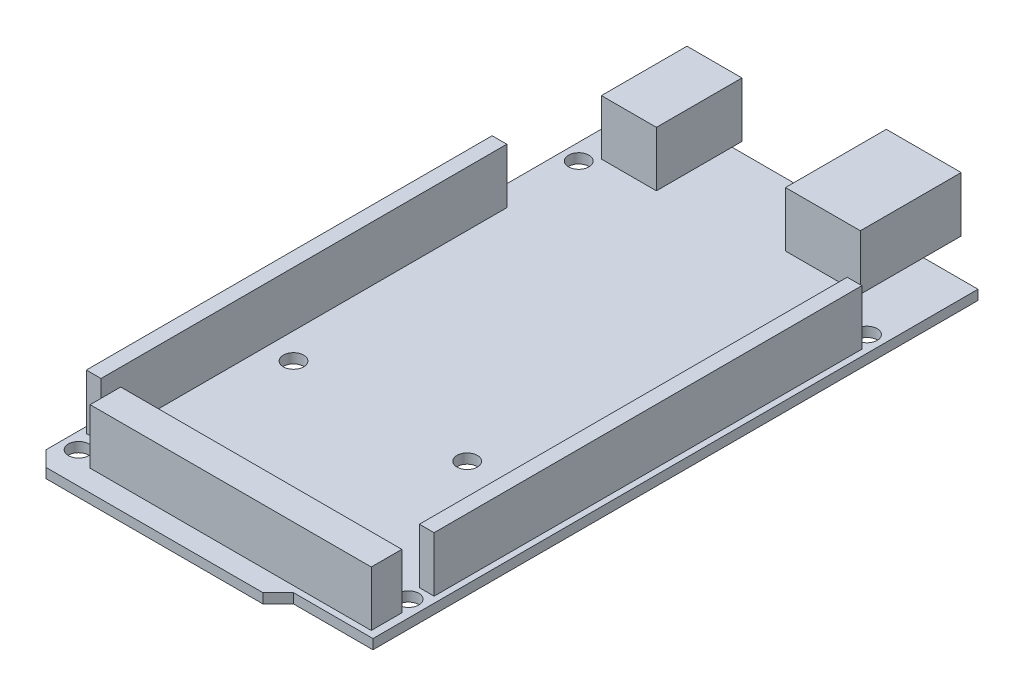
ISO-10303-21;
HEADER;
FILE_DESCRIPTION(('STEP AP214'),'2;1');
FILE_NAME('part.step','',(''),(''),'','','');
FILE_SCHEMA(('AUTOMOTIVE_DESIGN { 1 0 10303 214 1 1 1 1 }'));
ENDSEC;
DATA;
#1=APPLICATION_CONTEXT('core data for automotive mechanical design processes');
#2=APPLICATION_PROTOCOL_DEFINITION('international standard','automotive_design',2000,#1);
#3=PRODUCT_CONTEXT('',#1,'mechanical');
#4=PRODUCT('Part','Part','',(#3));
#5=PRODUCT_RELATED_PRODUCT_CATEGORY('part','',(#4));
#6=PRODUCT_DEFINITION_FORMATION('','',#4);
#7=PRODUCT_DEFINITION_CONTEXT('part definition',#1,'design');
#8=PRODUCT_DEFINITION('design','',#6,#7);
#9=PRODUCT_DEFINITION_SHAPE('','',#8);
#10=(LENGTH_UNIT() NAMED_UNIT(*) SI_UNIT(.MILLI.,.METRE.));
#11=(NAMED_UNIT(*) PLANE_ANGLE_UNIT() SI_UNIT($,.RADIAN.));
#12=(NAMED_UNIT(*) SI_UNIT($,.STERADIAN.) SOLID_ANGLE_UNIT());
#13=UNCERTAINTY_MEASURE_WITH_UNIT(LENGTH_MEASURE(1.E-05),#10,'distance_accuracy_value','');
#14=(GEOMETRIC_REPRESENTATION_CONTEXT(3) GLOBAL_UNCERTAINTY_ASSIGNED_CONTEXT((#13)) GLOBAL_UNIT_ASSIGNED_CONTEXT((#10,
#11,#12)) REPRESENTATION_CONTEXT('',''));
#15=CARTESIAN_POINT('',(0.,0.,0.));
#16=DIRECTION('',(0.,0.,1.));
#17=DIRECTION('',(1.,0.,0.));
#18=AXIS2_PLACEMENT_3D('',#15,#16,#17);
#19=CARTESIAN_POINT('',(0.,1.6,0.));
#20=DIRECTION('',(0.,1.,0.));
#21=DIRECTION('',(0.,0.,1.));
#22=AXIS2_PLACEMENT_3D('',#19,#20,#21);
#23=PLANE('',#22);
#24=CARTESIAN_POINT('',(50.833333333334,1.6,-8.5));
#25=DIRECTION('',(0.,1.,0.));
#26=DIRECTION('',(0.,0.,1.));
#27=AXIS2_PLACEMENT_3D('',#24,#25,#26);
#28=CIRCLE('',#27,1.66666666666666);
#29=CARTESIAN_POINT('',(50.833333333334,1.6,-6.83333333333334));
#30=VERTEX_POINT('',#29);
#31=EDGE_CURVE('E374',#30,#30,#28,.T.);
#32=ORIENTED_EDGE('',*,*,#31,.F.);
#33=EDGE_LOOP('',(#32));
#34=FACE_BOUND('',#33,.T.);
#35=CARTESIAN_POINT('',(2.66666666666667,1.6,-2.66666666666667));
#36=DIRECTION('',(0.,1.,0.));
#37=DIRECTION('',(0.,0.,1.));
#38=AXIS2_PLACEMENT_3D('',#35,#36,#37);
#39=CIRCLE('',#38,1.66666666666667);
#40=CARTESIAN_POINT('',(2.66666666666667,1.6,-1.));
#41=VERTEX_POINT('',#40);
#42=EDGE_CURVE('E377',#41,#41,#39,.T.);
#43=ORIENTED_EDGE('',*,*,#42,.F.);
#44=EDGE_LOOP('',(#43));
#45=FACE_BOUND('',#44,.T.);
#46=CARTESIAN_POINT('',(36.0833333333333,1.6,-32.8333333333333));
#47=DIRECTION('',(0.,1.,0.));
#48=DIRECTION('',(0.,0.,1.));
#49=AXIS2_PLACEMENT_3D('',#46,#47,#48);
#50=CIRCLE('',#49,1.66666666666666);
#51=CARTESIAN_POINT('',(36.0833333333333,1.6,-31.1666666666667));
#52=VERTEX_POINT('',#51);
#53=EDGE_CURVE('E381',#52,#52,#50,.T.);
#54=ORIENTED_EDGE('',*,*,#53,.F.);
#55=EDGE_LOOP('',(#54));
#56=FACE_BOUND('',#55,.T.);
#57=CARTESIAN_POINT('',(7.66666666666667,1.6,-32.8333333333333));
#58=DIRECTION('',(0.,1.,0.));
#59=DIRECTION('',(0.,0.,1.));
#60=AXIS2_PLACEMENT_3D('',#57,#58,#59);
#61=CIRCLE('',#60,1.66666666666667);
#62=CARTESIAN_POINT('',(7.66666666666667,1.6,-31.1666666666667));
#63=VERTEX_POINT('',#62);
#64=EDGE_CURVE('E384',#63,#63,#61,.T.);
#65=ORIENTED_EDGE('',*,*,#64,.F.);
#66=EDGE_LOOP('',(#65));
#67=FACE_BOUND('',#66,.T.);
#68=CARTESIAN_POINT('',(50.8333333333333,1.6,-83.5));
#69=DIRECTION('',(0.,1.,0.));
#70=DIRECTION('',(0.,0.,1.));
#71=AXIS2_PLACEMENT_3D('',#68,#69,#70);
#72=CIRCLE('',#71,1.66666666666667);
#73=CARTESIAN_POINT('',(50.8333333333333,1.6,-81.8333333333333));
#74=VERTEX_POINT('',#73);
#75=EDGE_CURVE('E387',#74,#74,#72,.T.);
#76=ORIENTED_EDGE('',*,*,#75,.F.);
#77=EDGE_LOOP('',(#76));
#78=FACE_BOUND('',#77,.T.);
#79=CARTESIAN_POINT('',(2.66666666666667,1.6,-84.5));
#80=DIRECTION('',(0.,1.,0.));
#81=DIRECTION('',(0.,0.,1.));
#82=AXIS2_PLACEMENT_3D('',#79,#80,#81);
#83=CIRCLE('',#82,1.66666666666667);
#84=CARTESIAN_POINT('',(2.66666666666667,1.6,-82.8333333333333));
#85=VERTEX_POINT('',#84);
#86=EDGE_CURVE('E390',#85,#85,#83,.T.);
#87=ORIENTED_EDGE('',*,*,#86,.F.);
#88=EDGE_LOOP('',(#87));
#89=FACE_BOUND('',#88,.T.);
#90=DIRECTION('',(1.,0.,0.));
#91=VECTOR('',#90,1.);
#92=CARTESIAN_POINT('',(6.22,1.6,-1.));
#93=LINE('',#92,#91);
#94=CARTESIAN_POINT('',(6.22,1.6,-1.));
#95=VERTEX_POINT('',#94);
#96=CARTESIAN_POINT('',(52.22,1.6,-1.));
#97=VERTEX_POINT('',#96);
#98=EDGE_CURVE('E358',#95,#97,#93,.T.);
#99=ORIENTED_EDGE('',*,*,#98,.F.);
#100=DIRECTION('',(0.,0.,1.));
#101=VECTOR('',#100,1.);
#102=CARTESIAN_POINT('',(6.22,1.6,-1.));
#103=LINE('',#102,#101);
#104=CARTESIAN_POINT('',(6.22,1.6,-6.));
#105=VERTEX_POINT('',#104);
#106=EDGE_CURVE('E344',#105,#95,#103,.T.);
#107=ORIENTED_EDGE('',*,*,#106,.F.);
#108=DIRECTION('',(-1.,0.,0.));
#109=VECTOR('',#108,1.);
#110=CARTESIAN_POINT('',(6.22,1.6,-6.));
#111=LINE('',#110,#109);
#112=CARTESIAN_POINT('',(52.22,1.6,-6.));
#113=VERTEX_POINT('',#112);
#114=EDGE_CURVE('E349',#113,#105,#111,.T.);
#115=ORIENTED_EDGE('',*,*,#114,.F.);
#116=DIRECTION('',(0.,0.,-1.));
#117=VECTOR('',#116,1.);
#118=CARTESIAN_POINT('',(52.22,1.6,-1.));
#119=LINE('',#118,#117);
#120=EDGE_CURVE('E360',#97,#113,#119,.T.);
#121=ORIENTED_EDGE('',*,*,#120,.F.);
#122=EDGE_LOOP('',(#99,#107,#115,#121));
#123=FACE_BOUND('',#122,.T.);
#124=DIRECTION('',(1.,0.,0.));
#125=VECTOR('',#124,1.);
#126=CARTESIAN_POINT('',(1.,1.6,-5.60000000000001));
#127=LINE('',#126,#125);
#128=CARTESIAN_POINT('',(1.,1.6,-5.60000000000001));
#129=VERTEX_POINT('',#128);
#130=CARTESIAN_POINT('',(3.4,1.6,-5.60000000000001));
#131=VERTEX_POINT('',#130);
#132=EDGE_CURVE('E329',#129,#131,#127,.T.);
#133=ORIENTED_EDGE('',*,*,#132,.F.);
#134=DIRECTION('',(0.,0.,1.));
#135=VECTOR('',#134,1.);
#136=CARTESIAN_POINT('',(1.,1.6,-5.60000000000001));
#137=LINE('',#136,#135);
#138=CARTESIAN_POINT('',(1.,1.6,-72.));
#139=VERTEX_POINT('',#138);
#140=EDGE_CURVE('E315',#139,#129,#137,.T.);
#141=ORIENTED_EDGE('',*,*,#140,.F.);
#142=DIRECTION('',(-1.,0.,0.));
#143=VECTOR('',#142,1.);
#144=CARTESIAN_POINT('',(1.,1.6,-72.));
#145=LINE('',#144,#143);
#146=CARTESIAN_POINT('',(3.39999999999998,1.6,-72.));
#147=VERTEX_POINT('',#146);
#148=EDGE_CURVE('E320',#147,#139,#145,.T.);
#149=ORIENTED_EDGE('',*,*,#148,.F.);
#150=DIRECTION('',(0.,0.,-1.));
#151=VECTOR('',#150,1.);
#152=CARTESIAN_POINT('',(3.4,1.6,-5.60000000000001));
#153=LINE('',#152,#151);
#154=EDGE_CURVE('E331',#131,#147,#153,.T.);
#155=ORIENTED_EDGE('',*,*,#154,.F.);
#156=EDGE_LOOP('',(#133,#141,#149,#155));
#157=FACE_BOUND('',#156,.T.);
#158=DIRECTION('',(1.,0.,0.));
#159=VECTOR('',#158,1.);
#160=CARTESIAN_POINT('',(50.1,1.6,-11.));
#161=LINE('',#160,#159);
#162=CARTESIAN_POINT('',(50.1,1.6,-11.));
#163=VERTEX_POINT('',#162);
#164=CARTESIAN_POINT('',(52.5,1.6,-11.));
#165=VERTEX_POINT('',#164);
#166=EDGE_CURVE('E300',#163,#165,#161,.T.);
#167=ORIENTED_EDGE('',*,*,#166,.F.);
#168=DIRECTION('',(0.,0.,1.));
#169=VECTOR('',#168,1.);
#170=CARTESIAN_POINT('',(50.1,1.6,-11.));
#171=LINE('',#170,#169);
#172=CARTESIAN_POINT('',(50.1,1.6,-81.));
#173=VERTEX_POINT('',#172);
#174=EDGE_CURVE('E286',#173,#163,#171,.T.);
#175=ORIENTED_EDGE('',*,*,#174,.F.);
#176=DIRECTION('',(-1.,0.,0.));
#177=VECTOR('',#176,1.);
#178=CARTESIAN_POINT('',(50.1,1.6,-81.));
#179=LINE('',#178,#177);
#180=CARTESIAN_POINT('',(52.5,1.6,-81.));
#181=VERTEX_POINT('',#180);
#182=EDGE_CURVE('E291',#181,#173,#179,.T.);
#183=ORIENTED_EDGE('',*,*,#182,.F.);
#184=DIRECTION('',(0.,0.,-1.));
#185=VECTOR('',#184,1.);
#186=CARTESIAN_POINT('',(52.5,1.6,-11.));
#187=LINE('',#186,#185);
#188=EDGE_CURVE('E302',#165,#181,#187,.T.);
#189=ORIENTED_EDGE('',*,*,#188,.F.);
#190=EDGE_LOOP('',(#167,#175,#183,#189));
#191=FACE_BOUND('',#190,.T.);
#192=DIRECTION('',(1.,0.,0.));
#193=VECTOR('',#192,1.);
#194=CARTESIAN_POINT('',(32.34,1.6,-88.66));
#195=LINE('',#194,#193);
#196=CARTESIAN_POINT('',(32.34,1.6,-88.66));
#197=VERTEX_POINT('',#196);
#198=CARTESIAN_POINT('',(44.59,1.6,-88.66));
#199=VERTEX_POINT('',#198);
#200=EDGE_CURVE('E512',#197,#199,#195,.T.);
#201=ORIENTED_EDGE('',*,*,#200,.F.);
#202=DIRECTION('',(0.,0.,1.));
#203=VECTOR('',#202,1.);
#204=CARTESIAN_POINT('',(32.34,1.6,-88.66));
#205=LINE('',#204,#203);
#206=CARTESIAN_POINT('',(32.34,1.6,-99.));
#207=VERTEX_POINT('',#206);
#208=EDGE_CURVE('E250',#207,#197,#205,.T.);
#209=ORIENTED_EDGE('',*,*,#208,.F.);
#210=DIRECTION('',(1.,0.,0.));
#211=VECTOR('',#210,1.);
#212=CARTESIAN_POINT('',(0.,1.6,-99.));
#213=LINE('',#212,#211);
#214=CARTESIAN_POINT('',(13.25,1.6,-99.));
#215=VERTEX_POINT('',#214);
#216=EDGE_CURVE('E503',#215,#207,#213,.T.);
#217=ORIENTED_EDGE('',*,*,#216,.F.);
#218=DIRECTION('',(0.,0.,-1.));
#219=VECTOR('',#218,1.);
#220=CARTESIAN_POINT('',(13.25,1.6,-86.63));
#221=LINE('',#220,#219);
#222=CARTESIAN_POINT('',(13.25,1.6,-86.63));
#223=VERTEX_POINT('',#222);
#224=EDGE_CURVE('E56',#223,#215,#221,.T.);
#225=ORIENTED_EDGE('',*,*,#224,.F.);
#226=DIRECTION('',(1.,0.,0.));
#227=VECTOR('',#226,1.);
#228=CARTESIAN_POINT('',(4.25,1.6,-86.63));
#229=LINE('',#228,#227);
#230=CARTESIAN_POINT('',(4.25,1.6,-86.63));
#231=VERTEX_POINT('',#230);
#232=EDGE_CURVE('E271',#231,#223,#229,.T.);
#233=ORIENTED_EDGE('',*,*,#232,.F.);
#234=DIRECTION('',(0.,0.,1.));
#235=VECTOR('',#234,1.);
#236=CARTESIAN_POINT('',(4.25,1.6,-86.63));
#237=LINE('',#236,#235);
#238=CARTESIAN_POINT('',(4.25,1.6,-99.));
#239=VERTEX_POINT('',#238);
#240=EDGE_CURVE('E251',#239,#231,#237,.T.);
#241=ORIENTED_EDGE('',*,*,#240,.F.);
#242=CARTESIAN_POINT('',(0.,1.6,-99.));
#243=VERTEX_POINT('',#242);
#244=EDGE_CURVE('E400',#243,#239,#213,.T.);
#245=ORIENTED_EDGE('',*,*,#244,.F.);
#246=DIRECTION('',(0.,0.,-1.));
#247=VECTOR('',#246,1.);
#248=CARTESIAN_POINT('',(0.,1.6,0.));
#249=LINE('',#248,#247);
#250=CARTESIAN_POINT('',(0.,1.6,0.));
#251=VERTEX_POINT('',#250);
#252=EDGE_CURVE('E403',#251,#243,#249,.T.);
#253=ORIENTED_EDGE('',*,*,#252,.F.);
#254=DIRECTION('',(-0.707106781186551,0.,-0.707106781186544));
#255=VECTOR('',#254,1.);
#256=CARTESIAN_POINT('',(0.,1.6,0.));
#257=LINE('',#256,#255);
#258=CARTESIAN_POINT('',(2.50000000000003,1.6,2.5));
#259=VERTEX_POINT('',#258);
#260=EDGE_CURVE('E407',#259,#251,#257,.T.);
#261=ORIENTED_EDGE('',*,*,#260,.F.);
#262=DIRECTION('',(1.,0.,0.));
#263=VECTOR('',#262,1.);
#264=CARTESIAN_POINT('',(0.,1.6,2.5));
#265=LINE('',#264,#263);
#266=CARTESIAN_POINT('',(38.,1.6,2.5));
#267=VERTEX_POINT('',#266);
#268=EDGE_CURVE('E410',#259,#267,#265,.T.);
#269=ORIENTED_EDGE('',*,*,#268,.T.);
#270=DIRECTION('',(0.707106781186547,0.,-0.707106781186549));
#271=VECTOR('',#270,1.);
#272=CARTESIAN_POINT('',(20.2500000000001,1.6,20.25));
#273=LINE('',#272,#271);
#274=CARTESIAN_POINT('',(40.5,1.6,0.));
#275=VERTEX_POINT('',#274);
#276=EDGE_CURVE('E412',#267,#275,#273,.T.);
#277=ORIENTED_EDGE('',*,*,#276,.T.);
#278=DIRECTION('',(1.,0.,0.));
#279=VECTOR('',#278,1.);
#280=CARTESIAN_POINT('',(0.,1.6,0.));
#281=LINE('',#280,#279);
#282=CARTESIAN_POINT('',(53.5,1.6,0.));
#283=VERTEX_POINT('',#282);
#284=EDGE_CURVE('E393',#275,#283,#281,.T.);
#285=ORIENTED_EDGE('',*,*,#284,.T.);
#286=DIRECTION('',(0.,0.,-1.));
#287=VECTOR('',#286,1.);
#288=CARTESIAN_POINT('',(53.5,1.6,0.));
#289=LINE('',#288,#287);
#290=CARTESIAN_POINT('',(53.5,1.6,-99.));
#291=VERTEX_POINT('',#290);
#292=EDGE_CURVE('E396',#283,#291,#289,.T.);
#293=ORIENTED_EDGE('',*,*,#292,.T.);
#294=CARTESIAN_POINT('',(44.59,1.6,-99.));
#295=VERTEX_POINT('',#294);
#296=EDGE_CURVE('E399',#295,#291,#213,.T.);
#297=ORIENTED_EDGE('',*,*,#296,.F.);
#298=DIRECTION('',(0.,0.,-1.));
#299=VECTOR('',#298,1.);
#300=CARTESIAN_POINT('',(44.59,1.6,-88.66));
#301=LINE('',#300,#299);
#302=EDGE_CURVE('E48',#199,#295,#301,.T.);
#303=ORIENTED_EDGE('',*,*,#302,.F.);
#304=EDGE_LOOP('',(#201,#209,#217,#225,#233,#241,#245,#253,#261,#269,#277,#285,#293,#297,#303));
#305=FACE_BOUND('',#304,.T.);
#306=ADVANCED_FACE('F33',(#34,#45,#56,#67,#78,#89,#123,#157,#191,#305),#23,.T.);
#307=CARTESIAN_POINT('',(0.,1.6,0.));
#308=DIRECTION('',(0.,0.,-1.));
#309=DIRECTION('',(-1.,0.,0.));
#310=AXIS2_PLACEMENT_3D('',#307,#308,#309);
#311=PLANE('',#310);
#312=DIRECTION('',(1.,0.,0.));
#313=VECTOR('',#312,1.);
#314=CARTESIAN_POINT('',(0.,0.,0.));
#315=LINE('',#314,#313);
#316=CARTESIAN_POINT('',(40.5,0.,0.));
#317=VERTEX_POINT('',#316);
#318=CARTESIAN_POINT('',(53.5,0.,0.));
#319=VERTEX_POINT('',#318);
#320=EDGE_CURVE('E432',#317,#319,#315,.T.);
#321=ORIENTED_EDGE('',*,*,#320,.T.);
#322=DIRECTION('',(0.,-1.,0.));
#323=VECTOR('',#322,1.);
#324=CARTESIAN_POINT('',(53.5,1.6,0.));
#325=LINE('',#324,#323);
#326=EDGE_CURVE('E11',#283,#319,#325,.T.);
#327=ORIENTED_EDGE('',*,*,#326,.F.);
#328=ORIENTED_EDGE('',*,*,#284,.F.);
#329=DIRECTION('',(0.,-1.,0.));
#330=VECTOR('',#329,1.);
#331=CARTESIAN_POINT('',(40.5,1.6,0.));
#332=LINE('',#331,#330);
#333=EDGE_CURVE('E414',#275,#317,#332,.T.);
#334=ORIENTED_EDGE('',*,*,#333,.T.);
#335=EDGE_LOOP('',(#321,#327,#328,#334));
#336=FACE_BOUND('',#335,.T.);
#337=ADVANCED_FACE('F529',(#336),#311,.F.);
#338=CARTESIAN_POINT('',(53.5,1.6,0.));
#339=DIRECTION('',(-1.,0.,0.));
#340=DIRECTION('',(0.,0.,1.));
#341=AXIS2_PLACEMENT_3D('',#338,#339,#340);
#342=PLANE('',#341);
#343=DIRECTION('',(0.,0.,-1.));
#344=VECTOR('',#343,1.);
#345=CARTESIAN_POINT('',(53.5,0.,0.));
#346=LINE('',#345,#344);
#347=CARTESIAN_POINT('',(53.5,0.,-99.));
#348=VERTEX_POINT('',#347);
#349=EDGE_CURVE('E435',#319,#348,#346,.T.);
#350=ORIENTED_EDGE('',*,*,#349,.T.);
#351=DIRECTION('',(0.,-1.,0.));
#352=VECTOR('',#351,1.);
#353=CARTESIAN_POINT('',(53.5,1.6,-99.));
#354=LINE('',#353,#352);
#355=EDGE_CURVE('E41',#291,#348,#354,.T.);
#356=ORIENTED_EDGE('',*,*,#355,.F.);
#357=ORIENTED_EDGE('',*,*,#292,.F.);
#358=ORIENTED_EDGE('',*,*,#326,.T.);
#359=EDGE_LOOP('',(#350,#356,#357,#358));
#360=FACE_BOUND('',#359,.T.);
#361=ADVANCED_FACE('F467',(#360),#342,.F.);
#362=CARTESIAN_POINT('',(0.,1.6,-99.));
#363=DIRECTION('',(0.,0.,-1.));
#364=DIRECTION('',(-1.,0.,0.));
#365=AXIS2_PLACEMENT_3D('',#362,#363,#364);
#366=PLANE('',#365);
#367=DIRECTION('',(1.,0.,0.));
#368=VECTOR('',#367,1.);
#369=CARTESIAN_POINT('',(0.,0.,-99.));
#370=LINE('',#369,#368);
#371=CARTESIAN_POINT('',(0.,0.,-99.));
#372=VERTEX_POINT('',#371);
#373=EDGE_CURVE('E438',#372,#348,#370,.T.);
#374=ORIENTED_EDGE('',*,*,#373,.F.);
#375=DIRECTION('',(0.,-1.,0.));
#376=VECTOR('',#375,1.);
#377=CARTESIAN_POINT('',(0.,1.6,-99.));
#378=LINE('',#377,#376);
#379=EDGE_CURVE('E459',#243,#372,#378,.T.);
#380=ORIENTED_EDGE('',*,*,#379,.F.);
#381=ORIENTED_EDGE('',*,*,#244,.T.);
#382=EDGE_CURVE('E404',#239,#215,#213,.T.);
#383=ORIENTED_EDGE('',*,*,#382,.T.);
#384=ORIENTED_EDGE('',*,*,#216,.T.);
#385=EDGE_CURVE('E504',#207,#295,#213,.T.);
#386=ORIENTED_EDGE('',*,*,#385,.T.);
#387=ORIENTED_EDGE('',*,*,#296,.T.);
#388=ORIENTED_EDGE('',*,*,#355,.T.);
#389=EDGE_LOOP('',(#374,#380,#381,#383,#384,#386,#387,#388));
#390=FACE_BOUND('',#389,.T.);
#391=ADVANCED_FACE('F463',(#390),#366,.T.);
#392=CARTESIAN_POINT('',(0.,1.6,0.));
#393=DIRECTION('',(-1.,0.,0.));
#394=DIRECTION('',(0.,0.,1.));
#395=AXIS2_PLACEMENT_3D('',#392,#393,#394);
#396=PLANE('',#395);
#397=DIRECTION('',(0.,0.,-1.));
#398=VECTOR('',#397,1.);
#399=CARTESIAN_POINT('',(0.,0.,0.));
#400=LINE('',#399,#398);
#401=CARTESIAN_POINT('',(0.,0.,0.));
#402=VERTEX_POINT('',#401);
#403=EDGE_CURVE('E441',#402,#372,#400,.T.);
#404=ORIENTED_EDGE('',*,*,#403,.F.);
#405=DIRECTION('',(0.,-1.,0.));
#406=VECTOR('',#405,1.);
#407=CARTESIAN_POINT('',(0.,1.6,0.));
#408=LINE('',#407,#406);
#409=EDGE_CURVE('E457',#251,#402,#408,.T.);
#410=ORIENTED_EDGE('',*,*,#409,.F.);
#411=ORIENTED_EDGE('',*,*,#252,.T.);
#412=ORIENTED_EDGE('',*,*,#379,.T.);
#413=EDGE_LOOP('',(#404,#410,#411,#412));
#414=FACE_BOUND('',#413,.T.);
#415=ADVANCED_FACE('F476',(#414),#396,.T.);
#416=CARTESIAN_POINT('',(0.,1.6,0.));
#417=DIRECTION('',(-0.707106781186544,0.,0.707106781186551));
#418=DIRECTION('',(0.707106781186551,0.,0.707106781186544));
#419=AXIS2_PLACEMENT_3D('',#416,#417,#418);
#420=PLANE('',#419);
#421=DIRECTION('',(-0.707106781186551,0.,-0.707106781186544));
#422=VECTOR('',#421,1.);
#423=CARTESIAN_POINT('',(0.,0.,0.));
#424=LINE('',#423,#422);
#425=CARTESIAN_POINT('',(2.50000000000003,0.,2.5));
#426=VERTEX_POINT('',#425);
#427=EDGE_CURVE('E444',#426,#402,#424,.T.);
#428=ORIENTED_EDGE('',*,*,#427,.F.);
#429=DIRECTION('',(0.,-1.,0.));
#430=VECTOR('',#429,1.);
#431=CARTESIAN_POINT('',(2.50000000000003,1.6,2.5));
#432=LINE('',#431,#430);
#433=EDGE_CURVE('E455',#259,#426,#432,.T.);
#434=ORIENTED_EDGE('',*,*,#433,.F.);
#435=ORIENTED_EDGE('',*,*,#260,.T.);
#436=ORIENTED_EDGE('',*,*,#409,.T.);
#437=EDGE_LOOP('',(#428,#434,#435,#436));
#438=FACE_BOUND('',#437,.T.);
#439=ADVANCED_FACE('F538',(#438),#420,.T.);
#440=CARTESIAN_POINT('',(0.,1.6,2.5));
#441=DIRECTION('',(0.,0.,-1.));
#442=DIRECTION('',(-1.,0.,0.));
#443=AXIS2_PLACEMENT_3D('',#440,#441,#442);
#444=PLANE('',#443);
#445=DIRECTION('',(1.,0.,0.));
#446=VECTOR('',#445,1.);
#447=CARTESIAN_POINT('',(0.,0.,2.5));
#448=LINE('',#447,#446);
#449=CARTESIAN_POINT('',(38.,0.,2.5));
#450=VERTEX_POINT('',#449);
#451=EDGE_CURVE('E447',#426,#450,#448,.T.);
#452=ORIENTED_EDGE('',*,*,#451,.T.);
#453=DIRECTION('',(0.,-1.,0.));
#454=VECTOR('',#453,1.);
#455=CARTESIAN_POINT('',(38.,1.6,2.5));
#456=LINE('',#455,#454);
#457=EDGE_CURVE('E452',#267,#450,#456,.T.);
#458=ORIENTED_EDGE('',*,*,#457,.F.);
#459=ORIENTED_EDGE('',*,*,#268,.F.);
#460=ORIENTED_EDGE('',*,*,#433,.T.);
#461=EDGE_LOOP('',(#452,#458,#459,#460));
#462=FACE_BOUND('',#461,.T.);
#463=ADVANCED_FACE('F536',(#462),#444,.F.);
#464=CARTESIAN_POINT('',(2.66666666666667,1.6,-84.5));
#465=DIRECTION('',(0.,-1.,0.));
#466=DIRECTION('',(0.,0.,-1.));
#467=AXIS2_PLACEMENT_3D('',#464,#465,#466);
#468=CYLINDRICAL_SURFACE('',#467,1.66666666666667);
#469=ORIENTED_EDGE('',*,*,#86,.T.);
#470=EDGE_LOOP('',(#469));
#471=FACE_BOUND('',#470,.T.);
#472=CARTESIAN_POINT('',(2.66666666666667,0.,-84.5));
#473=DIRECTION('',(0.,1.,0.));
#474=DIRECTION('',(0.,0.,1.));
#475=AXIS2_PLACEMENT_3D('',#472,#473,#474);
#476=CIRCLE('',#475,1.66666666666667);
#477=CARTESIAN_POINT('',(2.66666666666667,0.,-82.8333333333333));
#478=VERTEX_POINT('',#477);
#479=EDGE_CURVE('E429',#478,#478,#476,.T.);
#480=ORIENTED_EDGE('',*,*,#479,.F.);
#481=EDGE_LOOP('',(#480));
#482=FACE_BOUND('',#481,.T.);
#483=ADVANCED_FACE('F545',(#471,#482),#468,.F.);
#484=CARTESIAN_POINT('',(50.8333333333333,1.6,-83.5));
#485=DIRECTION('',(0.,-1.,0.));
#486=DIRECTION('',(0.,0.,-1.));
#487=AXIS2_PLACEMENT_3D('',#484,#485,#486);
#488=CYLINDRICAL_SURFACE('',#487,1.66666666666667);
#489=ORIENTED_EDGE('',*,*,#75,.T.);
#490=EDGE_LOOP('',(#489));
#491=FACE_BOUND('',#490,.T.);
#492=CARTESIAN_POINT('',(50.8333333333333,0.,-83.5));
#493=DIRECTION('',(0.,1.,0.));
#494=DIRECTION('',(0.,0.,1.));
#495=AXIS2_PLACEMENT_3D('',#492,#493,#494);
#496=CIRCLE('',#495,1.66666666666667);
#497=CARTESIAN_POINT('',(50.8333333333333,0.,-81.8333333333333));
#498=VERTEX_POINT('',#497);
#499=EDGE_CURVE('E426',#498,#498,#496,.T.);
#500=ORIENTED_EDGE('',*,*,#499,.F.);
#501=EDGE_LOOP('',(#500));
#502=FACE_BOUND('',#501,.T.);
#503=ADVANCED_FACE('F591',(#491,#502),#488,.F.);
#504=CARTESIAN_POINT('',(7.66666666666667,1.6,-32.8333333333333));
#505=DIRECTION('',(0.,-1.,0.));
#506=DIRECTION('',(0.,0.,-1.));
#507=AXIS2_PLACEMENT_3D('',#504,#505,#506);
#508=CYLINDRICAL_SURFACE('',#507,1.66666666666667);
#509=ORIENTED_EDGE('',*,*,#64,.T.);
#510=EDGE_LOOP('',(#509));
#511=FACE_BOUND('',#510,.T.);
#512=CARTESIAN_POINT('',(7.66666666666667,0.,-32.8333333333333));
#513=DIRECTION('',(0.,1.,0.));
#514=DIRECTION('',(0.,0.,1.));
#515=AXIS2_PLACEMENT_3D('',#512,#513,#514);
#516=CIRCLE('',#515,1.66666666666667);
#517=CARTESIAN_POINT('',(7.66666666666667,0.,-31.1666666666667));
#518=VERTEX_POINT('',#517);
#519=EDGE_CURVE('E423',#518,#518,#516,.T.);
#520=ORIENTED_EDGE('',*,*,#519,.F.);
#521=EDGE_LOOP('',(#520));
#522=FACE_BOUND('',#521,.T.);
#523=ADVANCED_FACE('F597',(#511,#522),#508,.F.);
#524=CARTESIAN_POINT('',(36.0833333333333,1.6,-32.8333333333333));
#525=DIRECTION('',(0.,-1.,0.));
#526=DIRECTION('',(0.,0.,-1.));
#527=AXIS2_PLACEMENT_3D('',#524,#525,#526);
#528=CYLINDRICAL_SURFACE('',#527,1.66666666666666);
#529=ORIENTED_EDGE('',*,*,#53,.T.);
#530=EDGE_LOOP('',(#529));
#531=FACE_BOUND('',#530,.T.);
#532=CARTESIAN_POINT('',(36.0833333333333,0.,-32.8333333333333));
#533=DIRECTION('',(0.,1.,0.));
#534=DIRECTION('',(0.,0.,1.));
#535=AXIS2_PLACEMENT_3D('',#532,#533,#534);
#536=CIRCLE('',#535,1.66666666666666);
#537=CARTESIAN_POINT('',(36.0833333333333,0.,-31.1666666666667));
#538=VERTEX_POINT('',#537);
#539=EDGE_CURVE('E420',#538,#538,#536,.T.);
#540=ORIENTED_EDGE('',*,*,#539,.F.);
#541=EDGE_LOOP('',(#540));
#542=FACE_BOUND('',#541,.T.);
#543=ADVANCED_FACE('F575',(#531,#542),#528,.F.);
#544=CARTESIAN_POINT('',(2.66666666666667,1.6,-2.66666666666667));
#545=DIRECTION('',(0.,-1.,0.));
#546=DIRECTION('',(0.,0.,-1.));
#547=AXIS2_PLACEMENT_3D('',#544,#545,#546);
#548=CYLINDRICAL_SURFACE('',#547,1.66666666666667);
#549=ORIENTED_EDGE('',*,*,#42,.T.);
#550=EDGE_LOOP('',(#549));
#551=FACE_BOUND('',#550,.T.);
#552=CARTESIAN_POINT('',(2.66666666666667,0.,-2.66666666666667));
#553=DIRECTION('',(0.,1.,0.));
#554=DIRECTION('',(0.,0.,1.));
#555=AXIS2_PLACEMENT_3D('',#552,#553,#554);
#556=CIRCLE('',#555,1.66666666666667);
#557=CARTESIAN_POINT('',(2.66666666666667,0.,-1.));
#558=VERTEX_POINT('',#557);
#559=EDGE_CURVE('E417',#558,#558,#556,.T.);
#560=ORIENTED_EDGE('',*,*,#559,.F.);
#561=EDGE_LOOP('',(#560));
#562=FACE_BOUND('',#561,.T.);
#563=ADVANCED_FACE('F570',(#551,#562),#548,.F.);
#564=CARTESIAN_POINT('',(50.833333333334,1.6,-8.5));
#565=DIRECTION('',(0.,-1.,0.));
#566=DIRECTION('',(0.,0.,-1.));
#567=AXIS2_PLACEMENT_3D('',#564,#565,#566);
#568=CYLINDRICAL_SURFACE('',#567,1.66666666666666);
#569=ORIENTED_EDGE('',*,*,#31,.T.);
#570=EDGE_LOOP('',(#569));
#571=FACE_BOUND('',#570,.T.);
#572=CARTESIAN_POINT('',(50.833333333334,0.,-8.5));
#573=DIRECTION('',(0.,1.,0.));
#574=DIRECTION('',(0.,0.,1.));
#575=AXIS2_PLACEMENT_3D('',#572,#573,#574);
#576=CIRCLE('',#575,1.66666666666666);
#577=CARTESIAN_POINT('',(50.833333333334,0.,-6.83333333333334));
#578=VERTEX_POINT('',#577);
#579=EDGE_CURVE('E373',#578,#578,#576,.T.);
#580=ORIENTED_EDGE('',*,*,#579,.F.);
#581=EDGE_LOOP('',(#580));
#582=FACE_BOUND('',#581,.T.);
#583=ADVANCED_FACE('F35',(#571,#582),#568,.F.);
#584=CARTESIAN_POINT('',(20.2500000000001,1.6,20.25));
#585=DIRECTION('',(-0.707106781186548,0.,-0.707106781186546));
#586=DIRECTION('',(-0.707106781186547,0.,0.707106781186549));
#587=AXIS2_PLACEMENT_3D('',#584,#585,#586);
#588=PLANE('',#587);
#589=DIRECTION('',(0.707106781186547,0.,-0.707106781186549));
#590=VECTOR('',#589,1.);
#591=CARTESIAN_POINT('',(20.2500000000001,0.,20.25));
#592=LINE('',#591,#590);
#593=EDGE_CURVE('E378',#450,#317,#592,.T.);
#594=ORIENTED_EDGE('',*,*,#593,.T.);
#595=ORIENTED_EDGE('',*,*,#333,.F.);
#596=ORIENTED_EDGE('',*,*,#276,.F.);
#597=ORIENTED_EDGE('',*,*,#457,.T.);
#598=EDGE_LOOP('',(#594,#595,#596,#597));
#599=FACE_BOUND('',#598,.T.);
#600=ADVANCED_FACE('F532',(#599),#588,.F.);
#601=CARTESIAN_POINT('',(0.,0.,0.));
#602=DIRECTION('',(0.,1.,0.));
#603=DIRECTION('',(0.,0.,1.));
#604=AXIS2_PLACEMENT_3D('',#601,#602,#603);
#605=PLANE('',#604);
#606=ORIENTED_EDGE('',*,*,#579,.T.);
#607=EDGE_LOOP('',(#606));
#608=FACE_BOUND('',#607,.T.);
#609=ORIENTED_EDGE('',*,*,#559,.T.);
#610=EDGE_LOOP('',(#609));
#611=FACE_BOUND('',#610,.T.);
#612=ORIENTED_EDGE('',*,*,#539,.T.);
#613=EDGE_LOOP('',(#612));
#614=FACE_BOUND('',#613,.T.);
#615=ORIENTED_EDGE('',*,*,#519,.T.);
#616=EDGE_LOOP('',(#615));
#617=FACE_BOUND('',#616,.T.);
#618=ORIENTED_EDGE('',*,*,#499,.T.);
#619=EDGE_LOOP('',(#618));
#620=FACE_BOUND('',#619,.T.);
#621=ORIENTED_EDGE('',*,*,#479,.T.);
#622=EDGE_LOOP('',(#621));
#623=FACE_BOUND('',#622,.T.);
#624=ORIENTED_EDGE('',*,*,#320,.F.);
#625=ORIENTED_EDGE('',*,*,#593,.F.);
#626=ORIENTED_EDGE('',*,*,#451,.F.);
#627=ORIENTED_EDGE('',*,*,#427,.T.);
#628=ORIENTED_EDGE('',*,*,#403,.T.);
#629=ORIENTED_EDGE('',*,*,#373,.T.);
#630=ORIENTED_EDGE('',*,*,#349,.F.);
#631=EDGE_LOOP('',(#624,#625,#626,#627,#628,#629,#630));
#632=FACE_BOUND('',#631,.T.);
#633=ADVANCED_FACE('F471',(#608,#611,#614,#617,#620,#623,#632),#605,.F.);
#634=CARTESIAN_POINT('',(6.22,10.6,-1.));
#635=DIRECTION('',(1.,0.,0.));
#636=DIRECTION('',(0.,0.,-1.));
#637=AXIS2_PLACEMENT_3D('',#634,#635,#636);
#638=PLANE('',#637);
#639=ORIENTED_EDGE('',*,*,#106,.T.);
#640=DIRECTION('',(0.,-1.,0.));
#641=VECTOR('',#640,1.);
#642=CARTESIAN_POINT('',(6.22,10.6,-1.));
#643=LINE('',#642,#641);
#644=CARTESIAN_POINT('',(6.22,10.6,-1.));
#645=VERTEX_POINT('',#644);
#646=EDGE_CURVE('E371',#645,#95,#643,.T.);
#647=ORIENTED_EDGE('',*,*,#646,.F.);
#648=DIRECTION('',(0.,0.,1.));
#649=VECTOR('',#648,1.);
#650=CARTESIAN_POINT('',(6.22,10.6,-1.));
#651=LINE('',#650,#649);
#652=CARTESIAN_POINT('',(6.22,10.6,-6.));
#653=VERTEX_POINT('',#652);
#654=EDGE_CURVE('E345',#653,#645,#651,.T.);
#655=ORIENTED_EDGE('',*,*,#654,.F.);
#656=DIRECTION('',(0.,-1.,0.));
#657=VECTOR('',#656,1.);
#658=CARTESIAN_POINT('',(6.22,10.6,-6.));
#659=LINE('',#658,#657);
#660=EDGE_CURVE('E355',#653,#105,#659,.T.);
#661=ORIENTED_EDGE('',*,*,#660,.T.);
#662=EDGE_LOOP('',(#639,#647,#655,#661));
#663=FACE_BOUND('',#662,.T.);
#664=ADVANCED_FACE('F561',(#663),#638,.F.);
#665=CARTESIAN_POINT('',(6.22,10.6,-1.));
#666=DIRECTION('',(0.,0.,-1.));
#667=DIRECTION('',(-1.,0.,0.));
#668=AXIS2_PLACEMENT_3D('',#665,#666,#667);
#669=PLANE('',#668);
#670=ORIENTED_EDGE('',*,*,#98,.T.);
#671=DIRECTION('',(0.,-1.,0.));
#672=VECTOR('',#671,1.);
#673=CARTESIAN_POINT('',(52.22,10.6,-1.));
#674=LINE('',#673,#672);
#675=CARTESIAN_POINT('',(52.22,10.6,-1.));
#676=VERTEX_POINT('',#675);
#677=EDGE_CURVE('E368',#676,#97,#674,.T.);
#678=ORIENTED_EDGE('',*,*,#677,.F.);
#679=DIRECTION('',(1.,0.,0.));
#680=VECTOR('',#679,1.);
#681=CARTESIAN_POINT('',(6.22,10.6,-1.));
#682=LINE('',#681,#680);
#683=EDGE_CURVE('E348',#645,#676,#682,.T.);
#684=ORIENTED_EDGE('',*,*,#683,.F.);
#685=ORIENTED_EDGE('',*,*,#646,.T.);
#686=EDGE_LOOP('',(#670,#678,#684,#685));
#687=FACE_BOUND('',#686,.T.);
#688=ADVANCED_FACE('F692',(#687),#669,.F.);
#689=CARTESIAN_POINT('',(52.22,10.6,-1.));
#690=DIRECTION('',(-1.,0.,0.));
#691=DIRECTION('',(0.,0.,1.));
#692=AXIS2_PLACEMENT_3D('',#689,#690,#691);
#693=PLANE('',#692);
#694=ORIENTED_EDGE('',*,*,#120,.T.);
#695=DIRECTION('',(0.,-1.,0.));
#696=VECTOR('',#695,1.);
#697=CARTESIAN_POINT('',(52.22,10.6,-6.));
#698=LINE('',#697,#696);
#699=CARTESIAN_POINT('',(52.22,10.6,-6.));
#700=VERTEX_POINT('',#699);
#701=EDGE_CURVE('E366',#700,#113,#698,.T.);
#702=ORIENTED_EDGE('',*,*,#701,.F.);
#703=DIRECTION('',(0.,0.,-1.));
#704=VECTOR('',#703,1.);
#705=CARTESIAN_POINT('',(52.22,10.6,-1.));
#706=LINE('',#705,#704);
#707=EDGE_CURVE('E351',#676,#700,#706,.T.);
#708=ORIENTED_EDGE('',*,*,#707,.F.);
#709=ORIENTED_EDGE('',*,*,#677,.T.);
#710=EDGE_LOOP('',(#694,#702,#708,#709));
#711=FACE_BOUND('',#710,.T.);
#712=ADVANCED_FACE('F689',(#711),#693,.F.);
#713=CARTESIAN_POINT('',(6.22,10.6,-6.));
#714=DIRECTION('',(0.,0.,1.));
#715=DIRECTION('',(1.,0.,0.));
#716=AXIS2_PLACEMENT_3D('',#713,#714,#715);
#717=PLANE('',#716);
#718=ORIENTED_EDGE('',*,*,#114,.T.);
#719=ORIENTED_EDGE('',*,*,#660,.F.);
#720=DIRECTION('',(-1.,0.,0.));
#721=VECTOR('',#720,1.);
#722=CARTESIAN_POINT('',(6.22,10.6,-6.));
#723=LINE('',#722,#721);
#724=EDGE_CURVE('E353',#700,#653,#723,.T.);
#725=ORIENTED_EDGE('',*,*,#724,.F.);
#726=ORIENTED_EDGE('',*,*,#701,.T.);
#727=EDGE_LOOP('',(#718,#719,#725,#726));
#728=FACE_BOUND('',#727,.T.);
#729=ADVANCED_FACE('F685',(#728),#717,.F.);
#730=CARTESIAN_POINT('',(0.,10.6,0.));
#731=DIRECTION('',(0.,-1.,0.));
#732=DIRECTION('',(0.,0.,-1.));
#733=AXIS2_PLACEMENT_3D('',#730,#731,#732);
#734=PLANE('',#733);
#735=ORIENTED_EDGE('',*,*,#654,.T.);
#736=ORIENTED_EDGE('',*,*,#683,.T.);
#737=ORIENTED_EDGE('',*,*,#707,.T.);
#738=ORIENTED_EDGE('',*,*,#724,.T.);
#739=EDGE_LOOP('',(#735,#736,#737,#738));
#740=FACE_BOUND('',#739,.T.);
#741=ADVANCED_FACE('F681',(#740),#734,.F.);
#742=CARTESIAN_POINT('',(1.,10.6,-5.60000000000001));
#743=DIRECTION('',(1.,0.,0.));
#744=DIRECTION('',(0.,0.,-1.));
#745=AXIS2_PLACEMENT_3D('',#742,#743,#744);
#746=PLANE('',#745);
#747=ORIENTED_EDGE('',*,*,#140,.T.);
#748=DIRECTION('',(0.,-1.,0.));
#749=VECTOR('',#748,1.);
#750=CARTESIAN_POINT('',(1.,10.6,-5.60000000000001));
#751=LINE('',#750,#749);
#752=CARTESIAN_POINT('',(1.,10.6,-5.60000000000001));
#753=VERTEX_POINT('',#752);
#754=EDGE_CURVE('E342',#753,#129,#751,.T.);
#755=ORIENTED_EDGE('',*,*,#754,.F.);
#756=DIRECTION('',(0.,0.,1.));
#757=VECTOR('',#756,1.);
#758=CARTESIAN_POINT('',(1.,10.6,-5.60000000000001));
#759=LINE('',#758,#757);
#760=CARTESIAN_POINT('',(1.,10.6,-72.));
#761=VERTEX_POINT('',#760);
#762=EDGE_CURVE('E316',#761,#753,#759,.T.);
#763=ORIENTED_EDGE('',*,*,#762,.F.);
#764=DIRECTION('',(0.,-1.,0.));
#765=VECTOR('',#764,1.);
#766=CARTESIAN_POINT('',(1.,10.6,-72.));
#767=LINE('',#766,#765);
#768=EDGE_CURVE('E326',#761,#139,#767,.T.);
#769=ORIENTED_EDGE('',*,*,#768,.T.);
#770=EDGE_LOOP('',(#747,#755,#763,#769));
#771=FACE_BOUND('',#770,.T.);
#772=ADVANCED_FACE('F677',(#771),#746,.F.);
#773=CARTESIAN_POINT('',(1.,10.6,-5.60000000000001));
#774=DIRECTION('',(0.,0.,-1.));
#775=DIRECTION('',(-1.,0.,0.));
#776=AXIS2_PLACEMENT_3D('',#773,#774,#775);
#777=PLANE('',#776);
#778=ORIENTED_EDGE('',*,*,#132,.T.);
#779=DIRECTION('',(0.,-1.,0.));
#780=VECTOR('',#779,1.);
#781=CARTESIAN_POINT('',(3.4,10.6,-5.60000000000001));
#782=LINE('',#781,#780);
#783=CARTESIAN_POINT('',(3.4,10.6,-5.60000000000001));
#784=VERTEX_POINT('',#783);
#785=EDGE_CURVE('E339',#784,#131,#782,.T.);
#786=ORIENTED_EDGE('',*,*,#785,.F.);
#787=DIRECTION('',(1.,0.,0.));
#788=VECTOR('',#787,1.);
#789=CARTESIAN_POINT('',(1.,10.6,-5.60000000000001));
#790=LINE('',#789,#788);
#791=EDGE_CURVE('E319',#753,#784,#790,.T.);
#792=ORIENTED_EDGE('',*,*,#791,.F.);
#793=ORIENTED_EDGE('',*,*,#754,.T.);
#794=EDGE_LOOP('',(#778,#786,#792,#793));
#795=FACE_BOUND('',#794,.T.);
#796=ADVANCED_FACE('F673',(#795),#777,.F.);
#797=CARTESIAN_POINT('',(3.4,10.6,-5.60000000000001));
#798=DIRECTION('',(-1.,0.,0.));
#799=DIRECTION('',(0.,0.,1.));
#800=AXIS2_PLACEMENT_3D('',#797,#798,#799);
#801=PLANE('',#800);
#802=ORIENTED_EDGE('',*,*,#154,.T.);
#803=DIRECTION('',(0.,-1.,0.));
#804=VECTOR('',#803,1.);
#805=CARTESIAN_POINT('',(3.39999999999998,10.6,-72.));
#806=LINE('',#805,#804);
#807=CARTESIAN_POINT('',(3.39999999999998,10.6,-72.));
#808=VERTEX_POINT('',#807);
#809=EDGE_CURVE('E337',#808,#147,#806,.T.);
#810=ORIENTED_EDGE('',*,*,#809,.F.);
#811=DIRECTION('',(0.,0.,-1.));
#812=VECTOR('',#811,1.);
#813=CARTESIAN_POINT('',(3.4,10.6,-5.60000000000001));
#814=LINE('',#813,#812);
#815=EDGE_CURVE('E322',#784,#808,#814,.T.);
#816=ORIENTED_EDGE('',*,*,#815,.F.);
#817=ORIENTED_EDGE('',*,*,#785,.T.);
#818=EDGE_LOOP('',(#802,#810,#816,#817));
#819=FACE_BOUND('',#818,.T.);
#820=ADVANCED_FACE('F669',(#819),#801,.F.);
#821=CARTESIAN_POINT('',(1.,10.6,-72.));
#822=DIRECTION('',(0.,0.,1.));
#823=DIRECTION('',(1.,0.,0.));
#824=AXIS2_PLACEMENT_3D('',#821,#822,#823);
#825=PLANE('',#824);
#826=ORIENTED_EDGE('',*,*,#148,.T.);
#827=ORIENTED_EDGE('',*,*,#768,.F.);
#828=DIRECTION('',(-1.,0.,0.));
#829=VECTOR('',#828,1.);
#830=CARTESIAN_POINT('',(1.,10.6,-72.));
#831=LINE('',#830,#829);
#832=EDGE_CURVE('E324',#808,#761,#831,.T.);
#833=ORIENTED_EDGE('',*,*,#832,.F.);
#834=ORIENTED_EDGE('',*,*,#809,.T.);
#835=EDGE_LOOP('',(#826,#827,#833,#834));
#836=FACE_BOUND('',#835,.T.);
#837=ADVANCED_FACE('F665',(#836),#825,.F.);
#838=CARTESIAN_POINT('',(0.,10.6,0.));
#839=DIRECTION('',(0.,-1.,0.));
#840=DIRECTION('',(0.,0.,-1.));
#841=AXIS2_PLACEMENT_3D('',#838,#839,#840);
#842=PLANE('',#841);
#843=ORIENTED_EDGE('',*,*,#762,.T.);
#844=ORIENTED_EDGE('',*,*,#791,.T.);
#845=ORIENTED_EDGE('',*,*,#815,.T.);
#846=ORIENTED_EDGE('',*,*,#832,.T.);
#847=EDGE_LOOP('',(#843,#844,#845,#846));
#848=FACE_BOUND('',#847,.T.);
#849=ADVANCED_FACE('F662',(#848),#842,.F.);
#850=CARTESIAN_POINT('',(50.1,10.6,-11.));
#851=DIRECTION('',(1.,0.,0.));
#852=DIRECTION('',(0.,0.,-1.));
#853=AXIS2_PLACEMENT_3D('',#850,#851,#852);
#854=PLANE('',#853);
#855=ORIENTED_EDGE('',*,*,#174,.T.);
#856=DIRECTION('',(0.,-1.,0.));
#857=VECTOR('',#856,1.);
#858=CARTESIAN_POINT('',(50.1,10.6,-11.));
#859=LINE('',#858,#857);
#860=CARTESIAN_POINT('',(50.1,10.6,-11.));
#861=VERTEX_POINT('',#860);
#862=EDGE_CURVE('E313',#861,#163,#859,.T.);
#863=ORIENTED_EDGE('',*,*,#862,.F.);
#864=DIRECTION('',(0.,0.,1.));
#865=VECTOR('',#864,1.);
#866=CARTESIAN_POINT('',(50.1,10.6,-11.));
#867=LINE('',#866,#865);
#868=CARTESIAN_POINT('',(50.1,10.6,-81.));
#869=VERTEX_POINT('',#868);
#870=EDGE_CURVE('E287',#869,#861,#867,.T.);
#871=ORIENTED_EDGE('',*,*,#870,.F.);
#872=DIRECTION('',(0.,-1.,0.));
#873=VECTOR('',#872,1.);
#874=CARTESIAN_POINT('',(50.1,10.6,-81.));
#875=LINE('',#874,#873);
#876=EDGE_CURVE('E297',#869,#173,#875,.T.);
#877=ORIENTED_EDGE('',*,*,#876,.T.);
#878=EDGE_LOOP('',(#855,#863,#871,#877));
#879=FACE_BOUND('',#878,.T.);
#880=ADVANCED_FACE('F645',(#879),#854,.F.);
#881=CARTESIAN_POINT('',(50.1,10.6,-11.));
#882=DIRECTION('',(0.,0.,-1.));
#883=DIRECTION('',(-1.,0.,0.));
#884=AXIS2_PLACEMENT_3D('',#881,#882,#883);
#885=PLANE('',#884);
#886=ORIENTED_EDGE('',*,*,#166,.T.);
#887=DIRECTION('',(0.,-1.,0.));
#888=VECTOR('',#887,1.);
#889=CARTESIAN_POINT('',(52.5,10.6,-11.));
#890=LINE('',#889,#888);
#891=CARTESIAN_POINT('',(52.5,10.6,-11.));
#892=VERTEX_POINT('',#891);
#893=EDGE_CURVE('E310',#892,#165,#890,.T.);
#894=ORIENTED_EDGE('',*,*,#893,.F.);
#895=DIRECTION('',(1.,0.,0.));
#896=VECTOR('',#895,1.);
#897=CARTESIAN_POINT('',(50.1,10.6,-11.));
#898=LINE('',#897,#896);
#899=EDGE_CURVE('E290',#861,#892,#898,.T.);
#900=ORIENTED_EDGE('',*,*,#899,.F.);
#901=ORIENTED_EDGE('',*,*,#862,.T.);
#902=EDGE_LOOP('',(#886,#894,#900,#901));
#903=FACE_BOUND('',#902,.T.);
#904=ADVANCED_FACE('F633',(#903),#885,.F.);
#905=CARTESIAN_POINT('',(52.5,10.6,-11.));
#906=DIRECTION('',(-1.,0.,0.));
#907=DIRECTION('',(0.,0.,1.));
#908=AXIS2_PLACEMENT_3D('',#905,#906,#907);
#909=PLANE('',#908);
#910=ORIENTED_EDGE('',*,*,#188,.T.);
#911=DIRECTION('',(0.,-1.,0.));
#912=VECTOR('',#911,1.);
#913=CARTESIAN_POINT('',(52.5,10.6,-81.));
#914=LINE('',#913,#912);
#915=CARTESIAN_POINT('',(52.5,10.6,-81.));
#916=VERTEX_POINT('',#915);
#917=EDGE_CURVE('E308',#916,#181,#914,.T.);
#918=ORIENTED_EDGE('',*,*,#917,.F.);
#919=DIRECTION('',(0.,0.,-1.));
#920=VECTOR('',#919,1.);
#921=CARTESIAN_POINT('',(52.5,10.6,-11.));
#922=LINE('',#921,#920);
#923=EDGE_CURVE('E293',#892,#916,#922,.T.);
#924=ORIENTED_EDGE('',*,*,#923,.F.);
#925=ORIENTED_EDGE('',*,*,#893,.T.);
#926=EDGE_LOOP('',(#910,#918,#924,#925));
#927=FACE_BOUND('',#926,.T.);
#928=ADVANCED_FACE('F637',(#927),#909,.F.);
#929=CARTESIAN_POINT('',(50.1,10.6,-81.));
#930=DIRECTION('',(0.,0.,1.));
#931=DIRECTION('',(1.,0.,0.));
#932=AXIS2_PLACEMENT_3D('',#929,#930,#931);
#933=PLANE('',#932);
#934=ORIENTED_EDGE('',*,*,#182,.T.);
#935=ORIENTED_EDGE('',*,*,#876,.F.);
#936=DIRECTION('',(-1.,0.,0.));
#937=VECTOR('',#936,1.);
#938=CARTESIAN_POINT('',(50.1,10.6,-81.));
#939=LINE('',#938,#937);
#940=EDGE_CURVE('E295',#916,#869,#939,.T.);
#941=ORIENTED_EDGE('',*,*,#940,.F.);
#942=ORIENTED_EDGE('',*,*,#917,.T.);
#943=EDGE_LOOP('',(#934,#935,#941,#942));
#944=FACE_BOUND('',#943,.T.);
#945=ADVANCED_FACE('F647',(#944),#933,.F.);
#946=CARTESIAN_POINT('',(0.,10.6,0.));
#947=DIRECTION('',(0.,-1.,0.));
#948=DIRECTION('',(0.,0.,-1.));
#949=AXIS2_PLACEMENT_3D('',#946,#947,#948);
#950=PLANE('',#949);
#951=ORIENTED_EDGE('',*,*,#870,.T.);
#952=ORIENTED_EDGE('',*,*,#899,.T.);
#953=ORIENTED_EDGE('',*,*,#923,.T.);
#954=ORIENTED_EDGE('',*,*,#940,.T.);
#955=EDGE_LOOP('',(#951,#952,#953,#954));
#956=FACE_BOUND('',#955,.T.);
#957=ADVANCED_FACE('F641',(#956),#950,.F.);
#958=CARTESIAN_POINT('',(4.25,10.6,-86.63));
#959=DIRECTION('',(1.,0.,0.));
#960=DIRECTION('',(0.,0.,-1.));
#961=AXIS2_PLACEMENT_3D('',#958,#959,#960);
#962=PLANE('',#961);
#963=CARTESIAN_POINT('',(4.25,1.6,-100.63));
#964=VERTEX_POINT('',#963);
#965=EDGE_CURVE('E253',#964,#239,#237,.T.);
#966=ORIENTED_EDGE('',*,*,#965,.T.);
#967=ORIENTED_EDGE('',*,*,#240,.T.);
#968=DIRECTION('',(0.,-1.,0.));
#969=VECTOR('',#968,1.);
#970=CARTESIAN_POINT('',(4.25,10.6,-86.63));
#971=LINE('',#970,#969);
#972=CARTESIAN_POINT('',(4.25,10.6,-86.63));
#973=VERTEX_POINT('',#972);
#974=EDGE_CURVE('E283',#973,#231,#971,.T.);
#975=ORIENTED_EDGE('',*,*,#974,.F.);
#976=DIRECTION('',(0.,0.,1.));
#977=VECTOR('',#976,1.);
#978=CARTESIAN_POINT('',(4.25,10.6,-86.63));
#979=LINE('',#978,#977);
#980=CARTESIAN_POINT('',(4.25,10.6,-100.63));
#981=VERTEX_POINT('',#980);
#982=EDGE_CURVE('E259',#981,#973,#979,.T.);
#983=ORIENTED_EDGE('',*,*,#982,.F.);
#984=DIRECTION('',(0.,-1.,0.));
#985=VECTOR('',#984,1.);
#986=CARTESIAN_POINT('',(4.25,10.6,-100.63));
#987=LINE('',#986,#985);
#988=EDGE_CURVE('E268',#981,#964,#987,.T.);
#989=ORIENTED_EDGE('',*,*,#988,.T.);
#990=EDGE_LOOP('',(#966,#967,#975,#983,#989));
#991=FACE_BOUND('',#990,.T.);
#992=ADVANCED_FACE('F486',(#991),#962,.F.);
#993=CARTESIAN_POINT('',(4.25,10.6,-86.63));
#994=DIRECTION('',(0.,0.,-1.));
#995=DIRECTION('',(-1.,0.,0.));
#996=AXIS2_PLACEMENT_3D('',#993,#994,#995);
#997=PLANE('',#996);
#998=ORIENTED_EDGE('',*,*,#232,.T.);
#999=DIRECTION('',(0.,-1.,0.));
#1000=VECTOR('',#999,1.);
#1001=CARTESIAN_POINT('',(13.25,10.6,-86.63));
#1002=LINE('',#1001,#1000);
#1003=CARTESIAN_POINT('',(13.25,10.6,-86.63));
#1004=VERTEX_POINT('',#1003);
#1005=EDGE_CURVE('E281',#1004,#223,#1002,.T.);
#1006=ORIENTED_EDGE('',*,*,#1005,.F.);
#1007=DIRECTION('',(1.,0.,0.));
#1008=VECTOR('',#1007,1.);
#1009=CARTESIAN_POINT('',(4.25,10.6,-86.63));
#1010=LINE('',#1009,#1008);
#1011=EDGE_CURVE('E262',#973,#1004,#1010,.T.);
#1012=ORIENTED_EDGE('',*,*,#1011,.F.);
#1013=ORIENTED_EDGE('',*,*,#974,.T.);
#1014=EDGE_LOOP('',(#998,#1006,#1012,#1013));
#1015=FACE_BOUND('',#1014,.T.);
#1016=ADVANCED_FACE('F490',(#1015),#997,.F.);
#1017=CARTESIAN_POINT('',(13.25,10.6,-86.63));
#1018=DIRECTION('',(-1.,0.,0.));
#1019=DIRECTION('',(0.,0.,1.));
#1020=AXIS2_PLACEMENT_3D('',#1017,#1018,#1019);
#1021=PLANE('',#1020);
#1022=ORIENTED_EDGE('',*,*,#224,.T.);
#1023=CARTESIAN_POINT('',(13.25,1.6,-100.63));
#1024=VERTEX_POINT('',#1023);
#1025=EDGE_CURVE('E273',#215,#1024,#221,.T.);
#1026=ORIENTED_EDGE('',*,*,#1025,.T.);
#1027=DIRECTION('',(0.,-1.,0.));
#1028=VECTOR('',#1027,1.);
#1029=CARTESIAN_POINT('',(13.25,10.6,-100.63));
#1030=LINE('',#1029,#1028);
#1031=CARTESIAN_POINT('',(13.25,10.6,-100.63));
#1032=VERTEX_POINT('',#1031);
#1033=EDGE_CURVE('E278',#1032,#1024,#1030,.T.);
#1034=ORIENTED_EDGE('',*,*,#1033,.F.);
#1035=DIRECTION('',(0.,0.,-1.));
#1036=VECTOR('',#1035,1.);
#1037=CARTESIAN_POINT('',(13.25,10.6,-86.63));
#1038=LINE('',#1037,#1036);
#1039=EDGE_CURVE('E265',#1004,#1032,#1038,.T.);
#1040=ORIENTED_EDGE('',*,*,#1039,.F.);
#1041=ORIENTED_EDGE('',*,*,#1005,.T.);
#1042=EDGE_LOOP('',(#1022,#1026,#1034,#1040,#1041));
#1043=FACE_BOUND('',#1042,.T.);
#1044=ADVANCED_FACE('F882',(#1043),#1021,.F.);
#1045=CARTESIAN_POINT('',(4.25,10.6,-100.63));
#1046=DIRECTION('',(0.,0.,1.));
#1047=DIRECTION('',(1.,0.,0.));
#1048=AXIS2_PLACEMENT_3D('',#1045,#1046,#1047);
#1049=PLANE('',#1048);
#1050=DIRECTION('',(-1.,0.,0.));
#1051=VECTOR('',#1050,1.);
#1052=CARTESIAN_POINT('',(4.25,1.6,-100.63));
#1053=LINE('',#1052,#1051);
#1054=EDGE_CURVE('E263',#1024,#964,#1053,.T.);
#1055=ORIENTED_EDGE('',*,*,#1054,.T.);
#1056=ORIENTED_EDGE('',*,*,#988,.F.);
#1057=DIRECTION('',(-1.,0.,0.));
#1058=VECTOR('',#1057,1.);
#1059=CARTESIAN_POINT('',(4.25,10.6,-100.63));
#1060=LINE('',#1059,#1058);
#1061=EDGE_CURVE('E267',#1032,#981,#1060,.T.);
#1062=ORIENTED_EDGE('',*,*,#1061,.F.);
#1063=ORIENTED_EDGE('',*,*,#1033,.T.);
#1064=EDGE_LOOP('',(#1055,#1056,#1062,#1063));
#1065=FACE_BOUND('',#1064,.T.);
#1066=ADVANCED_FACE('F890',(#1065),#1049,.F.);
#1067=CARTESIAN_POINT('',(0.,10.6,0.));
#1068=DIRECTION('',(0.,-1.,0.));
#1069=DIRECTION('',(0.,0.,-1.));
#1070=AXIS2_PLACEMENT_3D('',#1067,#1068,#1069);
#1071=PLANE('',#1070);
#1072=ORIENTED_EDGE('',*,*,#982,.T.);
#1073=ORIENTED_EDGE('',*,*,#1011,.T.);
#1074=ORIENTED_EDGE('',*,*,#1039,.T.);
#1075=ORIENTED_EDGE('',*,*,#1061,.T.);
#1076=EDGE_LOOP('',(#1072,#1073,#1074,#1075));
#1077=FACE_BOUND('',#1076,.T.);
#1078=ADVANCED_FACE('F494',(#1077),#1071,.F.);
#1079=CARTESIAN_POINT('',(0.,1.6,0.));
#1080=DIRECTION('',(0.,-1.,0.));
#1081=DIRECTION('',(0.,0.,-1.));
#1082=AXIS2_PLACEMENT_3D('',#1079,#1080,#1081);
#1083=PLANE('',#1082);
#1084=ORIENTED_EDGE('',*,*,#1025,.F.);
#1085=ORIENTED_EDGE('',*,*,#382,.F.);
#1086=ORIENTED_EDGE('',*,*,#965,.F.);
#1087=ORIENTED_EDGE('',*,*,#1054,.F.);
#1088=EDGE_LOOP('',(#1084,#1085,#1086,#1087));
#1089=FACE_BOUND('',#1088,.T.);
#1090=ADVANCED_FACE('F500',(#1089),#1083,.T.);
#1091=CARTESIAN_POINT('',(32.34,10.6,-88.66));
#1092=DIRECTION('',(1.,0.,0.));
#1093=DIRECTION('',(0.,0.,-1.));
#1094=AXIS2_PLACEMENT_3D('',#1091,#1092,#1093);
#1095=PLANE('',#1094);
#1096=CARTESIAN_POINT('',(32.34,1.6,-105.16));
#1097=VERTEX_POINT('',#1096);
#1098=EDGE_CURVE('E509',#1097,#207,#205,.T.);
#1099=ORIENTED_EDGE('',*,*,#1098,.T.);
#1100=ORIENTED_EDGE('',*,*,#208,.T.);
#1101=DIRECTION('',(0.,-1.,0.));
#1102=VECTOR('',#1101,1.);
#1103=CARTESIAN_POINT('',(32.34,10.6,-88.66));
#1104=LINE('',#1103,#1102);
#1105=CARTESIAN_POINT('',(32.34,10.6,-88.66));
#1106=VERTEX_POINT('',#1105);
#1107=EDGE_CURVE('E230',#1106,#197,#1104,.T.);
#1108=ORIENTED_EDGE('',*,*,#1107,.F.);
#1109=DIRECTION('',(0.,0.,1.));
#1110=VECTOR('',#1109,1.);
#1111=CARTESIAN_POINT('',(32.34,10.6,-88.66));
#1112=LINE('',#1111,#1110);
#1113=CARTESIAN_POINT('',(32.34,10.6,-105.16));
#1114=VERTEX_POINT('',#1113);
#1115=EDGE_CURVE('E236',#1114,#1106,#1112,.T.);
#1116=ORIENTED_EDGE('',*,*,#1115,.F.);
#1117=DIRECTION('',(0.,-1.,0.));
#1118=VECTOR('',#1117,1.);
#1119=CARTESIAN_POINT('',(32.34,10.6,-105.16));
#1120=LINE('',#1119,#1118);
#1121=EDGE_CURVE('E511',#1114,#1097,#1120,.T.);
#1122=ORIENTED_EDGE('',*,*,#1121,.T.);
#1123=EDGE_LOOP('',(#1099,#1100,#1108,#1116,#1122));
#1124=FACE_BOUND('',#1123,.T.);
#1125=ADVANCED_FACE('F248',(#1124),#1095,.F.);
#1126=CARTESIAN_POINT('',(32.34,10.6,-88.66));
#1127=DIRECTION('',(0.,0.,-1.));
#1128=DIRECTION('',(-1.,0.,0.));
#1129=AXIS2_PLACEMENT_3D('',#1126,#1127,#1128);
#1130=PLANE('',#1129);
#1131=ORIENTED_EDGE('',*,*,#200,.T.);
#1132=DIRECTION('',(0.,-1.,0.));
#1133=VECTOR('',#1132,1.);
#1134=CARTESIAN_POINT('',(44.59,10.6,-88.66));
#1135=LINE('',#1134,#1133);
#1136=CARTESIAN_POINT('',(44.59,10.6,-88.66));
#1137=VERTEX_POINT('',#1136);
#1138=EDGE_CURVE('E232',#1137,#199,#1135,.T.);
#1139=ORIENTED_EDGE('',*,*,#1138,.F.);
#1140=DIRECTION('',(1.,0.,0.));
#1141=VECTOR('',#1140,1.);
#1142=CARTESIAN_POINT('',(32.34,10.6,-88.66));
#1143=LINE('',#1142,#1141);
#1144=EDGE_CURVE('E226',#1106,#1137,#1143,.T.);
#1145=ORIENTED_EDGE('',*,*,#1144,.F.);
#1146=ORIENTED_EDGE('',*,*,#1107,.T.);
#1147=EDGE_LOOP('',(#1131,#1139,#1145,#1146));
#1148=FACE_BOUND('',#1147,.T.);
#1149=ADVANCED_FACE('F228',(#1148),#1130,.F.);
#1150=CARTESIAN_POINT('',(44.59,10.6,-88.66));
#1151=DIRECTION('',(-1.,0.,0.));
#1152=DIRECTION('',(0.,0.,1.));
#1153=AXIS2_PLACEMENT_3D('',#1150,#1151,#1152);
#1154=PLANE('',#1153);
#1155=ORIENTED_EDGE('',*,*,#302,.T.);
#1156=CARTESIAN_POINT('',(44.59,1.6,-105.16));
#1157=VERTEX_POINT('',#1156);
#1158=EDGE_CURVE('E510',#295,#1157,#301,.T.);
#1159=ORIENTED_EDGE('',*,*,#1158,.T.);
#1160=DIRECTION('',(0.,-1.,0.));
#1161=VECTOR('',#1160,1.);
#1162=CARTESIAN_POINT('',(44.59,10.6,-105.16));
#1163=LINE('',#1162,#1161);
#1164=CARTESIAN_POINT('',(44.59,10.6,-105.16));
#1165=VERTEX_POINT('',#1164);
#1166=EDGE_CURVE('E255',#1165,#1157,#1163,.T.);
#1167=ORIENTED_EDGE('',*,*,#1166,.F.);
#1168=DIRECTION('',(0.,0.,-1.));
#1169=VECTOR('',#1168,1.);
#1170=CARTESIAN_POINT('',(44.59,10.6,-88.66));
#1171=LINE('',#1170,#1169);
#1172=EDGE_CURVE('E235',#1137,#1165,#1171,.T.);
#1173=ORIENTED_EDGE('',*,*,#1172,.F.);
#1174=ORIENTED_EDGE('',*,*,#1138,.T.);
#1175=EDGE_LOOP('',(#1155,#1159,#1167,#1173,#1174));
#1176=FACE_BOUND('',#1175,.T.);
#1177=ADVANCED_FACE('F524',(#1176),#1154,.F.);
#1178=CARTESIAN_POINT('',(32.34,10.6,-105.16));
#1179=DIRECTION('',(0.,0.,1.));
#1180=DIRECTION('',(1.,0.,0.));
#1181=AXIS2_PLACEMENT_3D('',#1178,#1179,#1180);
#1182=PLANE('',#1181);
#1183=DIRECTION('',(-1.,0.,0.));
#1184=VECTOR('',#1183,1.);
#1185=CARTESIAN_POINT('',(32.34,1.6,-105.16));
#1186=LINE('',#1185,#1184);
#1187=EDGE_CURVE('E245',#1157,#1097,#1186,.T.);
#1188=ORIENTED_EDGE('',*,*,#1187,.T.);
#1189=ORIENTED_EDGE('',*,*,#1121,.F.);
#1190=DIRECTION('',(-1.,0.,0.));
#1191=VECTOR('',#1190,1.);
#1192=CARTESIAN_POINT('',(32.34,10.6,-105.16));
#1193=LINE('',#1192,#1191);
#1194=EDGE_CURVE('E241',#1165,#1114,#1193,.T.);
#1195=ORIENTED_EDGE('',*,*,#1194,.F.);
#1196=ORIENTED_EDGE('',*,*,#1166,.T.);
#1197=EDGE_LOOP('',(#1188,#1189,#1195,#1196));
#1198=FACE_BOUND('',#1197,.T.);
#1199=ADVANCED_FACE('F523',(#1198),#1182,.F.);
#1200=CARTESIAN_POINT('',(0.,10.6,0.));
#1201=DIRECTION('',(0.,-1.,0.));
#1202=DIRECTION('',(0.,0.,-1.));
#1203=AXIS2_PLACEMENT_3D('',#1200,#1201,#1202);
#1204=PLANE('',#1203);
#1205=ORIENTED_EDGE('',*,*,#1115,.T.);
#1206=ORIENTED_EDGE('',*,*,#1144,.T.);
#1207=ORIENTED_EDGE('',*,*,#1172,.T.);
#1208=ORIENTED_EDGE('',*,*,#1194,.T.);
#1209=EDGE_LOOP('',(#1205,#1206,#1207,#1208));
#1210=FACE_BOUND('',#1209,.T.);
#1211=ADVANCED_FACE('F239',(#1210),#1204,.F.);
#1212=CARTESIAN_POINT('',(0.,1.6,0.));
#1213=DIRECTION('',(0.,-1.,0.));
#1214=DIRECTION('',(0.,0.,-1.));
#1215=AXIS2_PLACEMENT_3D('',#1212,#1213,#1214);
#1216=PLANE('',#1215);
#1217=ORIENTED_EDGE('',*,*,#1158,.F.);
#1218=ORIENTED_EDGE('',*,*,#385,.F.);
#1219=ORIENTED_EDGE('',*,*,#1098,.F.);
#1220=ORIENTED_EDGE('',*,*,#1187,.F.);
#1221=EDGE_LOOP('',(#1217,#1218,#1219,#1220));
#1222=FACE_BOUND('',#1221,.T.);
#1223=ADVANCED_FACE('F507',(#1222),#1216,.T.);
#1224=CLOSED_SHELL('',(#306,#337,#361,#391,#415,#439,#463,#483,#503,#523,#543,#563,#583,#600,
#633,#664,#688,#712,#729,#741,#772,#796,#820,#837,#849,#880,#904,#928,#945,#957,#992,#1016,
#1044,#1066,#1078,#1090,#1125,#1149,#1177,#1199,#1211,#1223));
#1225=MANIFOLD_SOLID_BREP('B2',#1224);
#1226=ADVANCED_BREP_SHAPE_REPRESENTATION('',(#18,#1225),#14);
#1227=SHAPE_DEFINITION_REPRESENTATION(#9,#1226);
ENDSEC;
END-ISO-10303-21;
